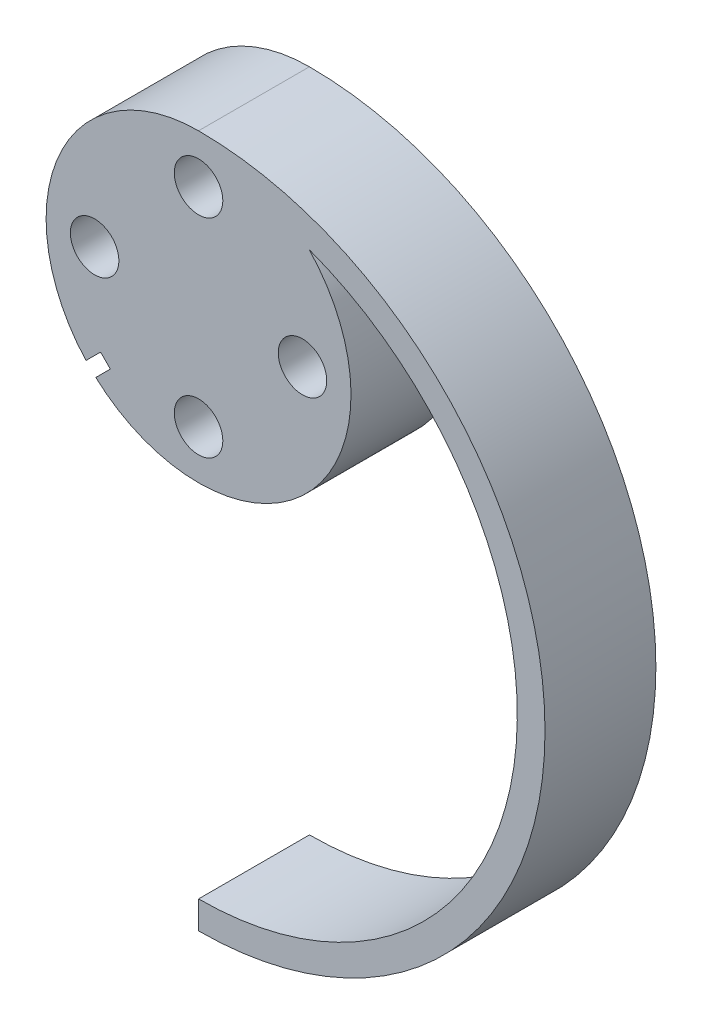
ISO-10303-21;
HEADER;
FILE_DESCRIPTION(('STEP AP214'),'2;1');
FILE_NAME('part.step','',(''),(''),'','','');
FILE_SCHEMA(('AUTOMOTIVE_DESIGN { 1 0 10303 214 1 1 1 1 }'));
ENDSEC;
DATA;
#1=APPLICATION_CONTEXT('core data for automotive mechanical design processes');
#2=APPLICATION_PROTOCOL_DEFINITION('international standard','automotive_design',2000,#1);
#3=PRODUCT_CONTEXT('',#1,'mechanical');
#4=PRODUCT('Part','Part','',(#3));
#5=PRODUCT_RELATED_PRODUCT_CATEGORY('part','',(#4));
#6=PRODUCT_DEFINITION_FORMATION('','',#4);
#7=PRODUCT_DEFINITION_CONTEXT('part definition',#1,'design');
#8=PRODUCT_DEFINITION('design','',#6,#7);
#9=PRODUCT_DEFINITION_SHAPE('','',#8);
#10=(LENGTH_UNIT() NAMED_UNIT(*) SI_UNIT(.MILLI.,.METRE.));
#11=(NAMED_UNIT(*) PLANE_ANGLE_UNIT() SI_UNIT($,.RADIAN.));
#12=(NAMED_UNIT(*) SI_UNIT($,.STERADIAN.) SOLID_ANGLE_UNIT());
#13=UNCERTAINTY_MEASURE_WITH_UNIT(LENGTH_MEASURE(1.E-05),#10,'distance_accuracy_value','');
#14=(GEOMETRIC_REPRESENTATION_CONTEXT(3) GLOBAL_UNCERTAINTY_ASSIGNED_CONTEXT((#13)) GLOBAL_UNIT_ASSIGNED_CONTEXT((#10,
#11,#12)) REPRESENTATION_CONTEXT('',''));
#15=CARTESIAN_POINT('',(0.,0.,0.));
#16=DIRECTION('',(0.,0.,1.));
#17=DIRECTION('',(1.,0.,0.));
#18=AXIS2_PLACEMENT_3D('',#15,#16,#17);
#19=CARTESIAN_POINT('',(0.,0.,8.));
#20=DIRECTION('',(0.,0.,-1.));
#21=DIRECTION('',(-1.,0.,0.));
#22=AXIS2_PLACEMENT_3D('',#19,#20,#21);
#23=CYLINDRICAL_SURFACE('',#22,11.);
#24=CARTESIAN_POINT('',(0.,0.,8.));
#25=DIRECTION('',(0.,0.,1.));
#26=DIRECTION('',(1.,0.,0.));
#27=AXIS2_PLACEMENT_3D('',#24,#25,#26);
#28=CIRCLE('',#27,11.);
#29=CARTESIAN_POINT('',(-7.41658174336676,-8.1236885245533,8.));
#30=VERTEX_POINT('',#29);
#31=CARTESIAN_POINT('',(7.97956573929654,7.57142857142857,8.));
#32=VERTEX_POINT('',#31);
#33=EDGE_CURVE('E157',#30,#32,#28,.T.);
#34=ORIENTED_EDGE('',*,*,#33,.F.);
#35=DIRECTION('',(0.,0.,-1.));
#36=VECTOR('',#35,1.);
#37=CARTESIAN_POINT('',(-7.41658174336676,-8.1236885245533,8.));
#38=LINE('',#37,#36);
#39=CARTESIAN_POINT('',(-7.41658174336676,-8.1236885245533,0.));
#40=VERTEX_POINT('',#39);
#41=EDGE_CURVE('E40',#30,#40,#38,.T.);
#42=ORIENTED_EDGE('',*,*,#41,.T.);
#43=CARTESIAN_POINT('',(0.,0.,0.));
#44=DIRECTION('',(0.,0.,1.));
#45=DIRECTION('',(1.,0.,0.));
#46=AXIS2_PLACEMENT_3D('',#43,#44,#45);
#47=CIRCLE('',#46,11.);
#48=CARTESIAN_POINT('',(7.97956573929654,7.57142857142857,0.));
#49=VERTEX_POINT('',#48);
#50=EDGE_CURVE('E165',#40,#49,#47,.T.);
#51=ORIENTED_EDGE('',*,*,#50,.T.);
#52=DIRECTION('',(0.,0.,-1.));
#53=VECTOR('',#52,1.);
#54=CARTESIAN_POINT('',(7.97956573929654,7.57142857142857,8.));
#55=LINE('',#54,#53);
#56=EDGE_CURVE('E175',#32,#49,#55,.T.);
#57=ORIENTED_EDGE('',*,*,#56,.F.);
#58=EDGE_LOOP('',(#34,#42,#51,#57));
#59=FACE_BOUND('',#58,.T.);
#60=ADVANCED_FACE('F32',(#59),#23,.T.);
#61=CARTESIAN_POINT('',(0.,-14.,8.));
#62=DIRECTION('',(0.,0.,-1.));
#63=DIRECTION('',(-1.,0.,0.));
#64=AXIS2_PLACEMENT_3D('',#61,#62,#63);
#65=PLANE('',#64);
#66=DIRECTION('',(0.707106781186547,-0.707106781186548,0.));
#67=VECTOR('',#66,1.);
#68=CARTESIAN_POINT('',(-7.07106781186547,-6.36396103067892,8.));
#69=LINE('',#68,#67);
#70=CARTESIAN_POINT('',(-7.07106781186547,-6.36396103067892,8.));
#71=VERTEX_POINT('',#70);
#72=CARTESIAN_POINT('',(-6.36396103067892,-7.07106781186547,8.));
#73=VERTEX_POINT('',#72);
#74=EDGE_CURVE('E115',#71,#73,#69,.T.);
#75=ORIENTED_EDGE('',*,*,#74,.T.);
#76=DIRECTION('',(-0.707106781186549,-0.707106781186546,0.));
#77=VECTOR('',#76,1.);
#78=CARTESIAN_POINT('',(-8.48528137423857,-9.19238815542511,8.));
#79=LINE('',#78,#77);
#80=EDGE_CURVE('E112',#73,#30,#79,.T.);
#81=ORIENTED_EDGE('',*,*,#80,.T.);
#82=ORIENTED_EDGE('',*,*,#33,.T.);
#83=CARTESIAN_POINT('',(0.,-14.,8.));
#84=DIRECTION('',(0.,0.,-1.));
#85=DIRECTION('',(-1.,0.,0.));
#86=AXIS2_PLACEMENT_3D('',#83,#84,#85);
#87=CIRCLE('',#86,23.);
#88=CARTESIAN_POINT('',(0.,-37.,8.));
#89=VERTEX_POINT('',#88);
#90=EDGE_CURVE('E159',#32,#89,#87,.T.);
#91=ORIENTED_EDGE('',*,*,#90,.T.);
#92=DIRECTION('',(0.,-1.,0.));
#93=VECTOR('',#92,1.);
#94=CARTESIAN_POINT('',(0.,-39.,8.));
#95=LINE('',#94,#93);
#96=CARTESIAN_POINT('',(0.,-39.,8.));
#97=VERTEX_POINT('',#96);
#98=EDGE_CURVE('E56',#89,#97,#95,.T.);
#99=ORIENTED_EDGE('',*,*,#98,.T.);
#100=CARTESIAN_POINT('',(0.,-14.,8.));
#101=DIRECTION('',(0.,0.,1.));
#102=DIRECTION('',(-1.,0.,0.));
#103=AXIS2_PLACEMENT_3D('',#100,#101,#102);
#104=CIRCLE('',#103,25.);
#105=CARTESIAN_POINT('',(0.,11.,8.));
#106=VERTEX_POINT('',#105);
#107=EDGE_CURVE('E155',#97,#106,#104,.T.);
#108=ORIENTED_EDGE('',*,*,#107,.T.);
#109=CARTESIAN_POINT('',(-8.1236885245533,-7.41658174336675,8.));
#110=VERTEX_POINT('',#109);
#111=EDGE_CURVE('E84',#106,#110,#28,.T.);
#112=ORIENTED_EDGE('',*,*,#111,.T.);
#113=DIRECTION('',(0.707106781186549,0.707106781186546,0.));
#114=VECTOR('',#113,1.);
#115=CARTESIAN_POINT('',(-9.19238815542511,-8.48528137423856,8.));
#116=LINE('',#115,#114);
#117=EDGE_CURVE('E47',#110,#71,#116,.T.);
#118=ORIENTED_EDGE('',*,*,#117,.T.);
#119=EDGE_LOOP('',(#75,#81,#82,#91,#99,#108,#112,#118));
#120=FACE_BOUND('',#119,.T.);
#121=CARTESIAN_POINT('',(0.,7.5,8.));
#122=DIRECTION('',(0.,0.,1.));
#123=DIRECTION('',(1.,0.,0.));
#124=AXIS2_PLACEMENT_3D('',#121,#122,#123);
#125=CIRCLE('',#124,1.75);
#126=CARTESIAN_POINT('',(1.75,7.5,8.));
#127=VERTEX_POINT('',#126);
#128=EDGE_CURVE('E149',#127,#127,#125,.T.);
#129=ORIENTED_EDGE('',*,*,#128,.F.);
#130=EDGE_LOOP('',(#129));
#131=FACE_BOUND('',#130,.T.);
#132=CARTESIAN_POINT('',(-7.5,0.,8.));
#133=DIRECTION('',(0.,0.,1.));
#134=DIRECTION('',(1.,0.,0.));
#135=AXIS2_PLACEMENT_3D('',#132,#133,#134);
#136=CIRCLE('',#135,1.75);
#137=CARTESIAN_POINT('',(-5.75,0.,8.));
#138=VERTEX_POINT('',#137);
#139=EDGE_CURVE('E143',#138,#138,#136,.T.);
#140=ORIENTED_EDGE('',*,*,#139,.F.);
#141=EDGE_LOOP('',(#140));
#142=FACE_BOUND('',#141,.T.);
#143=CARTESIAN_POINT('',(0.,-7.5,8.));
#144=DIRECTION('',(0.,0.,1.));
#145=DIRECTION('',(1.,0.,0.));
#146=AXIS2_PLACEMENT_3D('',#143,#144,#145);
#147=CIRCLE('',#146,1.75);
#148=CARTESIAN_POINT('',(1.75,-7.5,8.));
#149=VERTEX_POINT('',#148);
#150=EDGE_CURVE('E137',#149,#149,#147,.T.);
#151=ORIENTED_EDGE('',*,*,#150,.F.);
#152=EDGE_LOOP('',(#151));
#153=FACE_BOUND('',#152,.T.);
#154=CARTESIAN_POINT('',(7.5,0.,8.));
#155=DIRECTION('',(0.,0.,1.));
#156=DIRECTION('',(1.,0.,0.));
#157=AXIS2_PLACEMENT_3D('',#154,#155,#156);
#158=CIRCLE('',#157,1.75);
#159=CARTESIAN_POINT('',(9.25,0.,8.));
#160=VERTEX_POINT('',#159);
#161=EDGE_CURVE('E131',#160,#160,#158,.T.);
#162=ORIENTED_EDGE('',*,*,#161,.F.);
#163=EDGE_LOOP('',(#162));
#164=FACE_BOUND('',#163,.T.);
#165=ADVANCED_FACE('F121',(#120,#131,#142,#153,#164),#65,.F.);
#166=CARTESIAN_POINT('',(0.,-14.,0.));
#167=DIRECTION('',(0.,0.,-1.));
#168=DIRECTION('',(-1.,0.,0.));
#169=AXIS2_PLACEMENT_3D('',#166,#167,#168);
#170=PLANE('',#169);
#171=DIRECTION('',(-0.707106781186549,-0.707106781186546,0.));
#172=VECTOR('',#171,1.);
#173=CARTESIAN_POINT('',(-6.64644660940671,-7.35355339059326,0.));
#174=LINE('',#173,#172);
#175=CARTESIAN_POINT('',(-6.36396103067892,-7.07106781186547,0.));
#176=VERTEX_POINT('',#175);
#177=EDGE_CURVE('E128',#176,#40,#174,.T.);
#178=ORIENTED_EDGE('',*,*,#177,.F.);
#179=DIRECTION('',(0.707106781186547,-0.707106781186548,0.));
#180=VECTOR('',#179,1.);
#181=CARTESIAN_POINT('',(0.2824855787278,-13.7175144212722,0.));
#182=LINE('',#181,#180);
#183=CARTESIAN_POINT('',(-7.07106781186547,-6.36396103067892,0.));
#184=VERTEX_POINT('',#183);
#185=EDGE_CURVE('E11',#184,#176,#182,.T.);
#186=ORIENTED_EDGE('',*,*,#185,.F.);
#187=DIRECTION('',(0.707106781186549,0.707106781186546,0.));
#188=VECTOR('',#187,1.);
#189=CARTESIAN_POINT('',(-7.35355339059326,-6.64644660940671,0.));
#190=LINE('',#189,#188);
#191=CARTESIAN_POINT('',(-8.12368852455331,-7.41658174336676,0.));
#192=VERTEX_POINT('',#191);
#193=EDGE_CURVE('E108',#192,#184,#190,.T.);
#194=ORIENTED_EDGE('',*,*,#193,.F.);
#195=CARTESIAN_POINT('',(0.,11.,0.));
#196=VERTEX_POINT('',#195);
#197=EDGE_CURVE('E166',#196,#192,#47,.T.);
#198=ORIENTED_EDGE('',*,*,#197,.F.);
#199=CARTESIAN_POINT('',(0.,-14.,0.));
#200=DIRECTION('',(0.,0.,1.));
#201=DIRECTION('',(-1.,0.,0.));
#202=AXIS2_PLACEMENT_3D('',#199,#200,#201);
#203=CIRCLE('',#202,25.);
#204=CARTESIAN_POINT('',(0.,-39.,0.));
#205=VERTEX_POINT('',#204);
#206=EDGE_CURVE('E152',#205,#196,#203,.T.);
#207=ORIENTED_EDGE('',*,*,#206,.F.);
#208=DIRECTION('',(0.,-1.,0.));
#209=VECTOR('',#208,1.);
#210=CARTESIAN_POINT('',(0.,-39.,0.));
#211=LINE('',#210,#209);
#212=CARTESIAN_POINT('',(0.,-37.,0.));
#213=VERTEX_POINT('',#212);
#214=EDGE_CURVE('E77',#213,#205,#211,.T.);
#215=ORIENTED_EDGE('',*,*,#214,.F.);
#216=CARTESIAN_POINT('',(0.,-14.,0.));
#217=DIRECTION('',(0.,0.,-1.));
#218=DIRECTION('',(-1.,0.,0.));
#219=AXIS2_PLACEMENT_3D('',#216,#217,#218);
#220=CIRCLE('',#219,23.);
#221=EDGE_CURVE('E169',#49,#213,#220,.T.);
#222=ORIENTED_EDGE('',*,*,#221,.F.);
#223=ORIENTED_EDGE('',*,*,#50,.F.);
#224=EDGE_LOOP('',(#178,#186,#194,#198,#207,#215,#222,#223));
#225=FACE_BOUND('',#224,.T.);
#226=CARTESIAN_POINT('',(0.,-7.5,0.));
#227=DIRECTION('',(0.,0.,1.));
#228=DIRECTION('',(1.,0.,0.));
#229=AXIS2_PLACEMENT_3D('',#226,#227,#228);
#230=CIRCLE('',#229,1.75);
#231=CARTESIAN_POINT('',(1.75,-7.5,0.));
#232=VERTEX_POINT('',#231);
#233=EDGE_CURVE('E134',#232,#232,#230,.T.);
#234=ORIENTED_EDGE('',*,*,#233,.T.);
#235=EDGE_LOOP('',(#234));
#236=FACE_BOUND('',#235,.T.);
#237=CARTESIAN_POINT('',(0.,7.5,0.));
#238=DIRECTION('',(0.,0.,1.));
#239=DIRECTION('',(1.,0.,0.));
#240=AXIS2_PLACEMENT_3D('',#237,#238,#239);
#241=CIRCLE('',#240,1.75);
#242=CARTESIAN_POINT('',(1.75,7.5,0.));
#243=VERTEX_POINT('',#242);
#244=EDGE_CURVE('E146',#243,#243,#241,.T.);
#245=ORIENTED_EDGE('',*,*,#244,.T.);
#246=EDGE_LOOP('',(#245));
#247=FACE_BOUND('',#246,.T.);
#248=CARTESIAN_POINT('',(-7.5,0.,0.));
#249=DIRECTION('',(0.,0.,1.));
#250=DIRECTION('',(1.,0.,0.));
#251=AXIS2_PLACEMENT_3D('',#248,#249,#250);
#252=CIRCLE('',#251,1.75);
#253=CARTESIAN_POINT('',(-5.75,0.,0.));
#254=VERTEX_POINT('',#253);
#255=EDGE_CURVE('E140',#254,#254,#252,.T.);
#256=ORIENTED_EDGE('',*,*,#255,.T.);
#257=EDGE_LOOP('',(#256));
#258=FACE_BOUND('',#257,.T.);
#259=CARTESIAN_POINT('',(7.5,0.,0.));
#260=DIRECTION('',(0.,0.,1.));
#261=DIRECTION('',(1.,0.,0.));
#262=AXIS2_PLACEMENT_3D('',#259,#260,#261);
#263=CIRCLE('',#262,1.75);
#264=CARTESIAN_POINT('',(9.25,0.,0.));
#265=VERTEX_POINT('',#264);
#266=EDGE_CURVE('E130',#265,#265,#263,.T.);
#267=ORIENTED_EDGE('',*,*,#266,.T.);
#268=EDGE_LOOP('',(#267));
#269=FACE_BOUND('',#268,.T.);
#270=ADVANCED_FACE('F190',(#225,#236,#247,#258,#269),#170,.T.);
#271=CARTESIAN_POINT('',(0.,-14.,8.));
#272=DIRECTION('',(0.,0.,-1.));
#273=DIRECTION('',(-1.,0.,0.));
#274=AXIS2_PLACEMENT_3D('',#271,#272,#273);
#275=CYLINDRICAL_SURFACE('',#274,25.);
#276=ORIENTED_EDGE('',*,*,#206,.T.);
#277=DIRECTION('',(0.,0.,-1.));
#278=VECTOR('',#277,1.);
#279=CARTESIAN_POINT('',(0.,11.,8.));
#280=LINE('',#279,#278);
#281=EDGE_CURVE('E178',#106,#196,#280,.T.);
#282=ORIENTED_EDGE('',*,*,#281,.F.);
#283=ORIENTED_EDGE('',*,*,#107,.F.);
#284=DIRECTION('',(0.,0.,-1.));
#285=VECTOR('',#284,1.);
#286=CARTESIAN_POINT('',(0.,-39.,8.));
#287=LINE('',#286,#285);
#288=EDGE_CURVE('E162',#97,#205,#287,.T.);
#289=ORIENTED_EDGE('',*,*,#288,.T.);
#290=EDGE_LOOP('',(#276,#282,#283,#289));
#291=FACE_BOUND('',#290,.T.);
#292=ADVANCED_FACE('F34',(#291),#275,.T.);
#293=ORIENTED_EDGE('',*,*,#197,.T.);
#294=DIRECTION('',(0.,0.,-1.));
#295=VECTOR('',#294,1.);
#296=CARTESIAN_POINT('',(-8.12368852455331,-7.41658174336676,8.));
#297=LINE('',#296,#295);
#298=EDGE_CURVE('E180',#192,#110,#297,.F.);
#299=ORIENTED_EDGE('',*,*,#298,.T.);
#300=ORIENTED_EDGE('',*,*,#111,.F.);
#301=ORIENTED_EDGE('',*,*,#281,.T.);
#302=EDGE_LOOP('',(#293,#299,#300,#301));
#303=FACE_BOUND('',#302,.T.);
#304=ADVANCED_FACE('F201',(#303),#23,.T.);
#305=CARTESIAN_POINT('',(0.,-14.,8.));
#306=DIRECTION('',(0.,0.,-1.));
#307=DIRECTION('',(-1.,0.,0.));
#308=AXIS2_PLACEMENT_3D('',#305,#306,#307);
#309=CYLINDRICAL_SURFACE('',#308,23.);
#310=ORIENTED_EDGE('',*,*,#221,.T.);
#311=DIRECTION('',(0.,0.,-1.));
#312=VECTOR('',#311,1.);
#313=CARTESIAN_POINT('',(0.,-37.,8.));
#314=LINE('',#313,#312);
#315=EDGE_CURVE('E173',#89,#213,#314,.T.);
#316=ORIENTED_EDGE('',*,*,#315,.F.);
#317=ORIENTED_EDGE('',*,*,#90,.F.);
#318=ORIENTED_EDGE('',*,*,#56,.T.);
#319=EDGE_LOOP('',(#310,#316,#317,#318));
#320=FACE_BOUND('',#319,.T.);
#321=ADVANCED_FACE('F195',(#320),#309,.F.);
#322=CARTESIAN_POINT('',(0.,-39.,8.));
#323=DIRECTION('',(1.,0.,0.));
#324=DIRECTION('',(0.,0.,-1.));
#325=AXIS2_PLACEMENT_3D('',#322,#323,#324);
#326=PLANE('',#325);
#327=ORIENTED_EDGE('',*,*,#214,.T.);
#328=ORIENTED_EDGE('',*,*,#288,.F.);
#329=ORIENTED_EDGE('',*,*,#98,.F.);
#330=ORIENTED_EDGE('',*,*,#315,.T.);
#331=EDGE_LOOP('',(#327,#328,#329,#330));
#332=FACE_BOUND('',#331,.T.);
#333=ADVANCED_FACE('F197',(#332),#326,.F.);
#334=CARTESIAN_POINT('',(0.,7.5,8.));
#335=DIRECTION('',(0.,0.,-1.));
#336=DIRECTION('',(-1.,0.,0.));
#337=AXIS2_PLACEMENT_3D('',#334,#335,#336);
#338=CYLINDRICAL_SURFACE('',#337,1.75);
#339=ORIENTED_EDGE('',*,*,#128,.T.);
#340=EDGE_LOOP('',(#339));
#341=FACE_BOUND('',#340,.T.);
#342=ORIENTED_EDGE('',*,*,#244,.F.);
#343=EDGE_LOOP('',(#342));
#344=FACE_BOUND('',#343,.T.);
#345=ADVANCED_FACE('F234',(#341,#344),#338,.F.);
#346=CARTESIAN_POINT('',(-7.5,0.,8.));
#347=DIRECTION('',(0.,0.,-1.));
#348=DIRECTION('',(-1.,0.,0.));
#349=AXIS2_PLACEMENT_3D('',#346,#347,#348);
#350=CYLINDRICAL_SURFACE('',#349,1.75);
#351=ORIENTED_EDGE('',*,*,#139,.T.);
#352=EDGE_LOOP('',(#351));
#353=FACE_BOUND('',#352,.T.);
#354=ORIENTED_EDGE('',*,*,#255,.F.);
#355=EDGE_LOOP('',(#354));
#356=FACE_BOUND('',#355,.T.);
#357=ADVANCED_FACE('F238',(#353,#356),#350,.F.);
#358=CARTESIAN_POINT('',(0.,-7.5,8.));
#359=DIRECTION('',(0.,0.,-1.));
#360=DIRECTION('',(-1.,0.,0.));
#361=AXIS2_PLACEMENT_3D('',#358,#359,#360);
#362=CYLINDRICAL_SURFACE('',#361,1.75);
#363=ORIENTED_EDGE('',*,*,#150,.T.);
#364=EDGE_LOOP('',(#363));
#365=FACE_BOUND('',#364,.T.);
#366=ORIENTED_EDGE('',*,*,#233,.F.);
#367=EDGE_LOOP('',(#366));
#368=FACE_BOUND('',#367,.T.);
#369=ADVANCED_FACE('F211',(#365,#368),#362,.F.);
#370=CARTESIAN_POINT('',(7.5,0.,8.));
#371=DIRECTION('',(0.,0.,-1.));
#372=DIRECTION('',(-1.,0.,0.));
#373=AXIS2_PLACEMENT_3D('',#370,#371,#372);
#374=CYLINDRICAL_SURFACE('',#373,1.75);
#375=ORIENTED_EDGE('',*,*,#161,.T.);
#376=EDGE_LOOP('',(#375));
#377=FACE_BOUND('',#376,.T.);
#378=ORIENTED_EDGE('',*,*,#266,.F.);
#379=EDGE_LOOP('',(#378));
#380=FACE_BOUND('',#379,.T.);
#381=ADVANCED_FACE('F204',(#377,#380),#374,.F.);
#382=CARTESIAN_POINT('',(-8.48528137423857,-9.19238815542511,8.));
#383=DIRECTION('',(0.707106781186546,-0.707106781186549,0.));
#384=DIRECTION('',(0.707106781186549,0.707106781186546,0.));
#385=AXIS2_PLACEMENT_3D('',#382,#383,#384);
#386=PLANE('',#385);
#387=ORIENTED_EDGE('',*,*,#177,.T.);
#388=ORIENTED_EDGE('',*,*,#41,.F.);
#389=ORIENTED_EDGE('',*,*,#80,.F.);
#390=DIRECTION('',(0.,0.,-1.));
#391=VECTOR('',#390,1.);
#392=CARTESIAN_POINT('',(-6.36396103067892,-7.07106781186547,8.));
#393=LINE('',#392,#391);
#394=EDGE_CURVE('E111',#73,#176,#393,.T.);
#395=ORIENTED_EDGE('',*,*,#394,.T.);
#396=EDGE_LOOP('',(#387,#388,#389,#395));
#397=FACE_BOUND('',#396,.T.);
#398=ADVANCED_FACE('F202',(#397),#386,.F.);
#399=CARTESIAN_POINT('',(-7.07106781186547,-6.36396103067892,8.));
#400=DIRECTION('',(0.707106781186548,0.707106781186547,0.));
#401=DIRECTION('',(-0.707106781186547,0.707106781186548,0.));
#402=AXIS2_PLACEMENT_3D('',#399,#400,#401);
#403=PLANE('',#402);
#404=ORIENTED_EDGE('',*,*,#185,.T.);
#405=ORIENTED_EDGE('',*,*,#394,.F.);
#406=ORIENTED_EDGE('',*,*,#74,.F.);
#407=DIRECTION('',(0.,0.,-1.));
#408=VECTOR('',#407,1.);
#409=CARTESIAN_POINT('',(-7.07106781186547,-6.36396103067892,8.));
#410=LINE('',#409,#408);
#411=EDGE_CURVE('E104',#71,#184,#410,.T.);
#412=ORIENTED_EDGE('',*,*,#411,.T.);
#413=EDGE_LOOP('',(#404,#405,#406,#412));
#414=FACE_BOUND('',#413,.T.);
#415=ADVANCED_FACE('F116',(#414),#403,.F.);
#416=CARTESIAN_POINT('',(-9.19238815542511,-8.48528137423856,8.));
#417=DIRECTION('',(-0.707106781186546,0.707106781186549,0.));
#418=DIRECTION('',(-0.707106781186549,-0.707106781186546,0.));
#419=AXIS2_PLACEMENT_3D('',#416,#417,#418);
#420=PLANE('',#419);
#421=ORIENTED_EDGE('',*,*,#193,.T.);
#422=ORIENTED_EDGE('',*,*,#411,.F.);
#423=ORIENTED_EDGE('',*,*,#117,.F.);
#424=ORIENTED_EDGE('',*,*,#298,.F.);
#425=EDGE_LOOP('',(#421,#422,#423,#424));
#426=FACE_BOUND('',#425,.T.);
#427=ADVANCED_FACE('F106',(#426),#420,.F.);
#428=CLOSED_SHELL('',(#60,#165,#270,#292,#304,#321,#333,#345,#357,#369,#381,#398,#415,#427));
#429=MANIFOLD_SOLID_BREP('B2',#428);
#430=ADVANCED_BREP_SHAPE_REPRESENTATION('',(#18,#429),#14);
#431=SHAPE_DEFINITION_REPRESENTATION(#9,#430);
ENDSEC;
END-ISO-10303-21;
